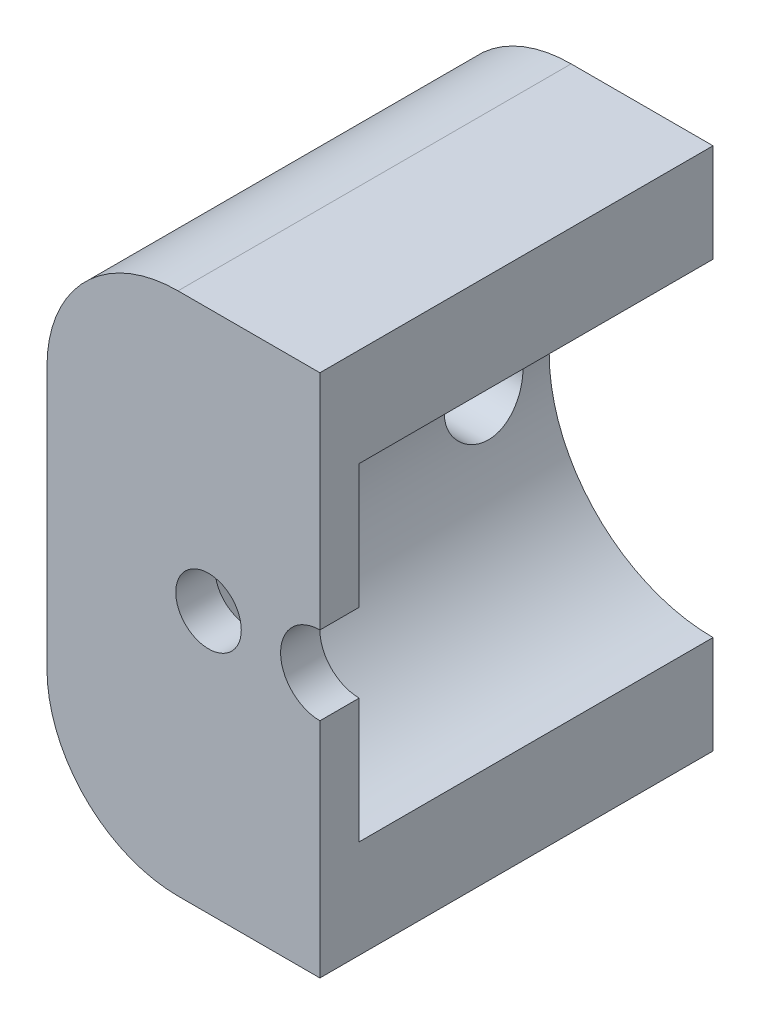
ISO-10303-21;
HEADER;
FILE_DESCRIPTION(('STEP AP214'),'2;1');
FILE_NAME('part.step','',(''),(''),'','','');
FILE_SCHEMA(('AUTOMOTIVE_DESIGN { 1 0 10303 214 1 1 1 1 }'));
ENDSEC;
DATA;
#1=APPLICATION_CONTEXT('core data for automotive mechanical design processes');
#2=APPLICATION_PROTOCOL_DEFINITION('international standard','automotive_design',2000,#1);
#3=PRODUCT_CONTEXT('',#1,'mechanical');
#4=PRODUCT('Part','Part','',(#3));
#5=PRODUCT_RELATED_PRODUCT_CATEGORY('part','',(#4));
#6=PRODUCT_DEFINITION_FORMATION('','',#4);
#7=PRODUCT_DEFINITION_CONTEXT('part definition',#1,'design');
#8=PRODUCT_DEFINITION('design','',#6,#7);
#9=PRODUCT_DEFINITION_SHAPE('','',#8);
#10=(LENGTH_UNIT() NAMED_UNIT(*) SI_UNIT(.MILLI.,.METRE.));
#11=(NAMED_UNIT(*) PLANE_ANGLE_UNIT() SI_UNIT($,.RADIAN.));
#12=(NAMED_UNIT(*) SI_UNIT($,.STERADIAN.) SOLID_ANGLE_UNIT());
#13=UNCERTAINTY_MEASURE_WITH_UNIT(LENGTH_MEASURE(1.E-05),#10,'distance_accuracy_value','');
#14=(GEOMETRIC_REPRESENTATION_CONTEXT(3) GLOBAL_UNCERTAINTY_ASSIGNED_CONTEXT((#13)) GLOBAL_UNIT_ASSIGNED_CONTEXT((#10,
#11,#12)) REPRESENTATION_CONTEXT('',''));
#15=CARTESIAN_POINT('',(0.,0.,0.));
#16=DIRECTION('',(0.,0.,1.));
#17=DIRECTION('',(1.,0.,0.));
#18=AXIS2_PLACEMENT_3D('',#15,#16,#17);
#19=CARTESIAN_POINT('',(-20.8276321226322,0.,5.));
#20=DIRECTION('',(1.,0.,0.));
#21=DIRECTION('',(0.,1.,0.));
#22=AXIS2_PLACEMENT_3D('',#19,#20,#21);
#23=CYLINDRICAL_SURFACE('',#22,2.);
#24=CARTESIAN_POINT('',(-20.8276321226322,0.,5.));
#25=DIRECTION('',(1.,0.,0.));
#26=DIRECTION('',(0.,1.,0.));
#27=AXIS2_PLACEMENT_3D('',#24,#25,#26);
#28=CIRCLE('',#27,2.);
#29=CARTESIAN_POINT('',(-20.8276321226322,1.99999999999999,5.));
#30=VERTEX_POINT('',#29);
#31=EDGE_CURVE('E263',#30,#30,#28,.T.);
#32=ORIENTED_EDGE('',*,*,#31,.F.);
#33=EDGE_LOOP('',(#32));
#34=FACE_BOUND('',#33,.T.);
#35=CARTESIAN_POINT('',(-17.,0.,5.));
#36=DIRECTION('',(1.,0.,0.));
#37=DIRECTION('',(0.,1.,0.));
#38=AXIS2_PLACEMENT_3D('',#35,#36,#37);
#39=CIRCLE('',#38,2.);
#40=CARTESIAN_POINT('',(-17.,1.99999999999999,5.));
#41=VERTEX_POINT('',#40);
#42=EDGE_CURVE('E271',#41,#41,#39,.T.);
#43=ORIENTED_EDGE('',*,*,#42,.T.);
#44=EDGE_LOOP('',(#43));
#45=FACE_BOUND('',#44,.T.);
#46=ADVANCED_FACE('F32',(#34,#45),#23,.F.);
#47=CARTESIAN_POINT('',(-20.8276321226322,0.,20.));
#48=DIRECTION('',(1.,0.,0.));
#49=DIRECTION('',(0.,1.,0.));
#50=AXIS2_PLACEMENT_3D('',#47,#48,#49);
#51=CYLINDRICAL_SURFACE('',#50,2.);
#52=CARTESIAN_POINT('',(-20.8276321226322,0.,20.));
#53=DIRECTION('',(1.,0.,0.));
#54=DIRECTION('',(0.,1.,0.));
#55=AXIS2_PLACEMENT_3D('',#52,#53,#54);
#56=CIRCLE('',#55,2.);
#57=CARTESIAN_POINT('',(-20.8276321226322,1.99999999999999,20.));
#58=VERTEX_POINT('',#57);
#59=EDGE_CURVE('E260',#58,#58,#56,.T.);
#60=ORIENTED_EDGE('',*,*,#59,.F.);
#61=EDGE_LOOP('',(#60));
#62=FACE_BOUND('',#61,.T.);
#63=CARTESIAN_POINT('',(-17.,0.,20.));
#64=DIRECTION('',(1.,0.,0.));
#65=DIRECTION('',(0.,1.,0.));
#66=AXIS2_PLACEMENT_3D('',#63,#64,#65);
#67=CIRCLE('',#66,2.);
#68=CARTESIAN_POINT('',(-17.,2.,20.));
#69=VERTEX_POINT('',#68);
#70=EDGE_CURVE('E272',#69,#69,#67,.T.);
#71=ORIENTED_EDGE('',*,*,#70,.T.);
#72=EDGE_LOOP('',(#71));
#73=FACE_BOUND('',#72,.T.);
#74=ADVANCED_FACE('F176',(#62,#73),#51,.F.);
#75=CARTESIAN_POINT('',(0.,0.,30.));
#76=DIRECTION('',(0.,0.,-1.));
#77=DIRECTION('',(-1.,0.,0.));
#78=AXIS2_PLACEMENT_3D('',#75,#76,#77);
#79=CYLINDRICAL_SURFACE('',#78,12.5);
#80=CARTESIAN_POINT('',(-12.1346610995116,2.99999999999999,5.));
#81=CARTESIAN_POINT('',(-12.1346643709057,2.99999492639599,4.83411368605636));
#82=CARTESIAN_POINT('',(-12.1380998279897,2.98619401575549,4.66816969817757));
#83=CARTESIAN_POINT('',(-12.1514386999622,2.93143372377317,4.34103164728038));
#84=CARTESIAN_POINT('',(-12.1613461803941,2.8904572712724,4.17984063651202));
#85=CARTESIAN_POINT('',(-12.1864438536979,2.78273587845347,3.86698770459709));
#86=CARTESIAN_POINT('',(-12.2016275682829,2.71602252749925,3.71531436580599));
#87=CARTESIAN_POINT('',(-12.2355589227548,2.55881551789465,3.42530045634281));
#88=CARTESIAN_POINT('',(-12.2543066403104,2.46832134098416,3.28696017633045));
#89=CARTESIAN_POINT('',(-12.2936793084446,2.26416092165144,3.02473118505982));
#90=CARTESIAN_POINT('',(-12.3143323081787,2.15010136587795,2.90115284401048));
#91=CARTESIAN_POINT('',(-12.3549444196641,1.9028957631587,2.67468460556583));
#92=CARTESIAN_POINT('',(-12.3749034702238,1.7697480383165,2.57179652880738));
#93=CARTESIAN_POINT('',(-12.4121875957975,1.48603435008244,2.38837356729399));
#94=CARTESIAN_POINT('',(-12.429475709008,1.33526735140697,2.30814147645071));
#95=CARTESIAN_POINT('',(-12.4591511096292,1.02190364344049,2.17427346268216));
#96=CARTESIAN_POINT('',(-12.471539061815,0.859308542342417,2.12063393185467));
#97=CARTESIAN_POINT('',(-12.4898200905274,0.530137152798902,2.04246184561352));
#98=CARTESIAN_POINT('',(-12.4958305032045,0.363692527540991,2.01740278579179));
#99=CARTESIAN_POINT('',(-12.5010873481438,0.0288605739758508,1.99545248030836));
#100=CARTESIAN_POINT('',(-12.5003347050497,-0.139526485618317,1.99855738407585));
#101=CARTESIAN_POINT('',(-12.4922383642801,-0.469819197188804,2.03246370078499));
#102=CARTESIAN_POINT('',(-12.4850298487431,-0.631786969117113,2.06269708416856));
#103=CARTESIAN_POINT('',(-12.4649879597451,-0.94827991582928,2.14909173796286));
#104=CARTESIAN_POINT('',(-12.4521543006312,-1.10280471220599,2.20525432510285));
#105=CARTESIAN_POINT('',(-12.4220937673228,-1.40154850796016,2.34238683274778));
#106=CARTESIAN_POINT('',(-12.4048305309055,-1.54566890739798,2.42356325576841));
#107=CARTESIAN_POINT('',(-12.3677903650575,-1.8184437481507,2.60826343366629));
#108=CARTESIAN_POINT('',(-12.3480130295253,-1.94709568430374,2.71179080077329));
#109=CARTESIAN_POINT('',(-12.307523454591,-2.18866676072893,2.9413154010846));
#110=CARTESIAN_POINT('',(-12.2868002024656,-2.30111257110785,3.06780936616896));
#111=CARTESIAN_POINT('',(-12.247210122564,-2.5032955488926,3.33807563615842));
#112=CARTESIAN_POINT('',(-12.2283433682075,-2.59303181841777,3.48184862390317));
#113=CARTESIAN_POINT('',(-12.1945661246798,-2.7475198631376,3.78346525626311));
#114=CARTESIAN_POINT('',(-12.1796724534131,-2.812165941329,3.94136505107637));
#115=CARTESIAN_POINT('',(-12.155748323081,-2.91385324316721,4.26623312347684));
#116=CARTESIAN_POINT('',(-12.1467167199581,-2.95089985341172,4.43319962468334));
#117=CARTESIAN_POINT('',(-12.1357772660229,-2.99556850234643,4.76709338006787));
#118=CARTESIAN_POINT('',(-12.1337008786289,-3.00388683328911,4.93392207251082));
#119=CARTESIAN_POINT('',(-12.1364495609797,-2.99276203410493,5.2665831940748));
#120=CARTESIAN_POINT('',(-12.1412740503119,-2.97332123871796,5.43241570580372));
#121=CARTESIAN_POINT('',(-12.1571201522343,-2.90783852027802,5.75584591726093));
#122=CARTESIAN_POINT('',(-12.1680489760353,-2.86219461484814,5.91352917591693));
#123=CARTESIAN_POINT('',(-12.1947857126682,-2.74603914988784,6.21900782066707));
#124=CARTESIAN_POINT('',(-12.2105941678427,-2.67552482603031,6.3668021054363));
#125=CARTESIAN_POINT('',(-12.2456689266469,-2.51014743676235,6.65127875220396));
#126=CARTESIAN_POINT('',(-12.2649930224287,-2.41486385815303,6.78770937400605));
#127=CARTESIAN_POINT('',(-12.3047764880024,-2.20319051610381,7.04290073389391));
#128=CARTESIAN_POINT('',(-12.3252360287629,-2.08679756812263,7.16165880098545));
#129=CARTESIAN_POINT('',(-12.3655511140332,-1.83302860512641,7.38091500960925));
#130=CARTESIAN_POINT('',(-12.3853821651221,-1.69523379949056,7.48093375598967));
#131=CARTESIAN_POINT('',(-12.4217193399952,-1.40439761806721,7.65640846308504));
#132=CARTESIAN_POINT('',(-12.438225632785,-1.25135701785303,7.73186567244466));
#133=CARTESIAN_POINT('',(-12.4659520953338,-0.935406182533397,7.85544747727503));
#134=CARTESIAN_POINT('',(-12.4772089625634,-0.772573732033524,7.90376232052163));
#135=CARTESIAN_POINT('',(-12.4933282808784,-0.440797516621211,7.97226782039686));
#136=CARTESIAN_POINT('',(-12.4981918632553,-0.271854838350959,7.99246345275549));
#137=CARTESIAN_POINT('',(-12.5009346170348,0.0628273325379051,8.00389586778703));
#138=CARTESIAN_POINT('',(-12.4989850590467,0.228541548592047,7.9958427559416));
#139=CARTESIAN_POINT('',(-12.4886960978661,0.55618158810627,7.95262003698245));
#140=CARTESIAN_POINT('',(-12.4803568581455,0.718107508375782,7.91745112359129));
#141=CARTESIAN_POINT('',(-12.4582475403262,1.03289533638029,7.82136317488429));
#142=CARTESIAN_POINT('',(-12.4445026408745,1.18579554017998,7.76056343055918));
#143=CARTESIAN_POINT('',(-12.4130357959962,1.47930912419136,7.6150497558514));
#144=CARTESIAN_POINT('',(-12.3953133850962,1.6199210636753,7.53033302625372));
#145=CARTESIAN_POINT('',(-12.3573152907204,1.8882670115378,7.33717452572309));
#146=CARTESIAN_POINT('',(-12.3369914041701,2.01564306622629,7.22824492925642));
#147=CARTESIAN_POINT('',(-12.2963112747441,2.25054951565268,6.99071238941027));
#148=CARTESIAN_POINT('',(-12.2759550250775,2.35807496614236,6.86210455926369));
#149=CARTESIAN_POINT('',(-12.2371275634283,2.55199485185679,6.58626060583986));
#150=CARTESIAN_POINT('',(-12.2186938455572,2.63800316633773,6.438747379493));
#151=CARTESIAN_POINT('',(-12.1862909651906,2.78387070894251,6.13093815349446));
#152=CARTESIAN_POINT('',(-12.1723183758181,2.84375002144868,5.97065208432893));
#153=CARTESIAN_POINT('',(-12.1527391085338,2.92614436386636,5.67540714648592));
#154=CARTESIAN_POINT('',(-12.1460087939348,2.95378236710749,5.5419291717888));
#155=CARTESIAN_POINT('',(-12.1369686046644,2.99071161192545,5.27231362592919));
#156=CARTESIAN_POINT('',(-12.1346584140208,3.00000416492674,5.13617624557697));
#157=CARTESIAN_POINT('',(-12.1346610995116,2.99999999999999,5.));
#158=B_SPLINE_CURVE_WITH_KNOTS('',3,(#80,#81,#82,#83,#84,#85,#86,#87,#88,#89,#90,#91,#92,#93,
#94,#95,#96,#97,#98,#99,#100,#101,#102,#103,#104,#105,#106,#107,#108,#109,#110,#111,#112,#113,
#114,#115,#116,#117,#118,#119,#120,#121,#122,#123,#124,#125,#126,#127,#128,#129,#130,#131,#132,
#133,#134,#135,#136,#137,#138,#139,#140,#141,#142,#143,#144,#145,#146,#147,#148,#149,#150,#151,
#152,#153,#154,#155,#156,#157),.UNSPECIFIED.,.T.,.F.,(4,2,2,2,2,2,2,2,2,2,2,2,2,2,2,2,2,2,2,2,2,
2,2,2,2,2,2,2,2,2,2,2,2,2,2,2,2,2,4),(0.,0.497159212189433,0.994631026538901,1.49149417875255,
1.98836816009861,2.49432418194046,3.00032470584734,3.51279830766303,4.02520236141814,
4.52800628486068,5.03074146609936,5.52318961529223,6.01566277459448,6.51231571921414,
7.00904899016388,7.51819168467208,8.02735450631452,8.5386395722652,9.04982482437227,
9.54852995993759,10.047193153326,10.5384749824062,11.0298114342859,11.5301065260645,
12.0304771548043,12.5422844123508,13.0540656468818,13.5622134292334,14.0702712827588,
14.5656502933719,15.0610166307768,15.5541024543049,16.047246011943,16.5514085771014,
17.0556965465884,17.56847227941,18.0808531634825,18.4890008491296,18.8971193572843),.UNSPECIFIED.);
#159=CARTESIAN_POINT('',(-12.1346610995116,2.99999999999999,5.));
#160=VERTEX_POINT('',#159);
#161=EDGE_CURVE('E159',#160,#160,#158,.T.);
#162=ORIENTED_EDGE('',*,*,#161,.T.);
#163=EDGE_LOOP('',(#162));
#164=FACE_BOUND('',#163,.T.);
#165=CARTESIAN_POINT('',(-12.1346610995116,3.,20.));
#166=CARTESIAN_POINT('',(-12.1346643709057,2.99999492639599,19.8341136860564));
#167=CARTESIAN_POINT('',(-12.1380998279897,2.98619401575549,19.6681696981776));
#168=CARTESIAN_POINT('',(-12.1514386999622,2.93143372377317,19.3410316472804));
#169=CARTESIAN_POINT('',(-12.1613461803941,2.8904572712724,19.179840636512));
#170=CARTESIAN_POINT('',(-12.1864438536979,2.78273587845348,18.8669877045971));
#171=CARTESIAN_POINT('',(-12.2016275682829,2.71602252749926,18.715314365806));
#172=CARTESIAN_POINT('',(-12.2355589227548,2.55881551789466,18.4253004563428));
#173=CARTESIAN_POINT('',(-12.2543066403104,2.46832134098416,18.2869601763305));
#174=CARTESIAN_POINT('',(-12.2936793084446,2.26416092165144,18.0247311850598));
#175=CARTESIAN_POINT('',(-12.3143323081787,2.15010136587795,17.9011528440105));
#176=CARTESIAN_POINT('',(-12.3549444196641,1.9028957631587,17.6746846055658));
#177=CARTESIAN_POINT('',(-12.3749034702238,1.7697480383165,17.5717965288074));
#178=CARTESIAN_POINT('',(-12.4121875957975,1.48603435008244,17.388373567294));
#179=CARTESIAN_POINT('',(-12.429475709008,1.33526735140697,17.3081414764507));
#180=CARTESIAN_POINT('',(-12.4591511096292,1.02190364344049,17.1742734626822));
#181=CARTESIAN_POINT('',(-12.471539061815,0.859308542342421,17.1206339318547));
#182=CARTESIAN_POINT('',(-12.4898200905274,0.530137152798906,17.0424618456135));
#183=CARTESIAN_POINT('',(-12.4958305032045,0.363692527540995,17.0174027857918));
#184=CARTESIAN_POINT('',(-12.5010873481438,0.0288605739758556,16.9954524803084));
#185=CARTESIAN_POINT('',(-12.5003347050497,-0.139526485618312,16.9985573840759));
#186=CARTESIAN_POINT('',(-12.4922383642801,-0.469819197188799,17.032463700785));
#187=CARTESIAN_POINT('',(-12.4850298487431,-0.631786969117108,17.0626970841686));
#188=CARTESIAN_POINT('',(-12.4649879597451,-0.948279915829275,17.1490917379629));
#189=CARTESIAN_POINT('',(-12.4521543006312,-1.10280471220598,17.2052543251028));
#190=CARTESIAN_POINT('',(-12.4220937673228,-1.40154850796015,17.3423868327478));
#191=CARTESIAN_POINT('',(-12.4048305309055,-1.54566890739798,17.4235632557684));
#192=CARTESIAN_POINT('',(-12.3677903650575,-1.8184437481507,17.6082634336663));
#193=CARTESIAN_POINT('',(-12.3480130295253,-1.94709568430374,17.7117908007733));
#194=CARTESIAN_POINT('',(-12.307523454591,-2.18866676072893,17.9413154010846));
#195=CARTESIAN_POINT('',(-12.2868002024656,-2.30111257110785,18.067809366169));
#196=CARTESIAN_POINT('',(-12.247210122564,-2.50329554889259,18.3380756361584));
#197=CARTESIAN_POINT('',(-12.2283433682075,-2.59303181841777,18.4818486239032));
#198=CARTESIAN_POINT('',(-12.1945661246798,-2.74751986313759,18.7834652562631));
#199=CARTESIAN_POINT('',(-12.1796724534131,-2.81216594132899,18.9413650510764));
#200=CARTESIAN_POINT('',(-12.155748323081,-2.91385324316721,19.2662331234768));
#201=CARTESIAN_POINT('',(-12.1467167199581,-2.95089985341172,19.4331996246833));
#202=CARTESIAN_POINT('',(-12.1357772660229,-2.99556850234643,19.7670933800679));
#203=CARTESIAN_POINT('',(-12.1337008786289,-3.00388683328911,19.9339220725108));
#204=CARTESIAN_POINT('',(-12.1364495609797,-2.99276203410494,20.2665831940748));
#205=CARTESIAN_POINT('',(-12.1412740503119,-2.97332123871796,20.4324157058037));
#206=CARTESIAN_POINT('',(-12.1571201522343,-2.90783852027802,20.7558459172609));
#207=CARTESIAN_POINT('',(-12.1680489760353,-2.86219461484815,20.9135291759169));
#208=CARTESIAN_POINT('',(-12.1947857126682,-2.74603914988785,21.2190078206671));
#209=CARTESIAN_POINT('',(-12.2105941678427,-2.67552482603031,21.3668021054363));
#210=CARTESIAN_POINT('',(-12.2456689266469,-2.51014743676235,21.651278752204));
#211=CARTESIAN_POINT('',(-12.2649930224287,-2.41486385815304,21.787709374006));
#212=CARTESIAN_POINT('',(-12.3047764880024,-2.20319051610381,22.0429007338939));
#213=CARTESIAN_POINT('',(-12.3252360287629,-2.08679756812264,22.1616588009855));
#214=CARTESIAN_POINT('',(-12.3655511140332,-1.83302860512641,22.3809150096093));
#215=CARTESIAN_POINT('',(-12.3853821651221,-1.69523379949057,22.4809337559897));
#216=CARTESIAN_POINT('',(-12.4217193399952,-1.40439761806722,22.656408463085));
#217=CARTESIAN_POINT('',(-12.438225632785,-1.25135701785303,22.7318656724447));
#218=CARTESIAN_POINT('',(-12.4659520953338,-0.935406182533403,22.855447477275));
#219=CARTESIAN_POINT('',(-12.4772089625634,-0.772573732033531,22.9037623205216));
#220=CARTESIAN_POINT('',(-12.4933282808784,-0.440797516621218,22.9722678203969));
#221=CARTESIAN_POINT('',(-12.4981918632553,-0.271854838350965,22.9924634527555));
#222=CARTESIAN_POINT('',(-12.5009346170348,0.0628273325378987,23.003895867787));
#223=CARTESIAN_POINT('',(-12.4989850590467,0.228541548592041,22.9958427559416));
#224=CARTESIAN_POINT('',(-12.4886960978661,0.556181588106263,22.9526200369825));
#225=CARTESIAN_POINT('',(-12.4803568581455,0.718107508375776,22.9174511235913));
#226=CARTESIAN_POINT('',(-12.4582475403262,1.03289533638028,22.8213631748843));
#227=CARTESIAN_POINT('',(-12.4445026408745,1.18579554017998,22.7605634305592));
#228=CARTESIAN_POINT('',(-12.4130357959962,1.47930912419135,22.6150497558514));
#229=CARTESIAN_POINT('',(-12.3953133850962,1.6199210636753,22.5303330262537));
#230=CARTESIAN_POINT('',(-12.3573152907204,1.8882670115378,22.3371745257231));
#231=CARTESIAN_POINT('',(-12.3369914041701,2.01564306622628,22.2282449292564));
#232=CARTESIAN_POINT('',(-12.2963112747441,2.25054951565268,21.9907123894103));
#233=CARTESIAN_POINT('',(-12.2759550250775,2.35807496614236,21.8621045592637));
#234=CARTESIAN_POINT('',(-12.2371275634283,2.55199485185679,21.5862606058399));
#235=CARTESIAN_POINT('',(-12.2186938455572,2.63800316633773,21.438747379493));
#236=CARTESIAN_POINT('',(-12.1862909651906,2.78387070894251,21.1309381534945));
#237=CARTESIAN_POINT('',(-12.1723183758181,2.84375002144868,20.9706520843289));
#238=CARTESIAN_POINT('',(-12.1527391085338,2.92614436386636,20.6754071464859));
#239=CARTESIAN_POINT('',(-12.1460087939348,2.95378236710749,20.5419291717888));
#240=CARTESIAN_POINT('',(-12.1369686046644,2.99071161192545,20.2723136259292));
#241=CARTESIAN_POINT('',(-12.1346584140208,3.00000416492674,20.136176245577));
#242=CARTESIAN_POINT('',(-12.1346610995116,3.,20.));
#243=B_SPLINE_CURVE_WITH_KNOTS('',3,(#165,#166,#167,#168,#169,#170,#171,#172,#173,#174,#175,
#176,#177,#178,#179,#180,#181,#182,#183,#184,#185,#186,#187,#188,#189,#190,#191,#192,#193,#194,
#195,#196,#197,#198,#199,#200,#201,#202,#203,#204,#205,#206,#207,#208,#209,#210,#211,#212,#213,
#214,#215,#216,#217,#218,#219,#220,#221,#222,#223,#224,#225,#226,#227,#228,#229,#230,#231,#232,
#233,#234,#235,#236,#237,#238,#239,#240,#241,#242),.UNSPECIFIED.,.T.,.F.,(4,2,2,2,2,2,2,2,2,2,2,
2,2,2,2,2,2,2,2,2,2,2,2,2,2,2,2,2,2,2,2,2,2,2,2,2,2,2,4),(0.,0.49715921218943,0.994631026538898,
1.49149417875254,1.98836816009861,2.49432418194045,3.00032470584734,3.51279830766303,
4.02520236141813,4.52800628486068,5.03074146609936,5.52318961529222,6.01566277459447,
6.51231571921414,7.00904899016388,7.51819168467208,8.02735450631452,8.5386395722652,
9.04982482437227,9.54852995993759,10.047193153326,10.5384749824062,11.0298114342859,
11.5301065260645,12.0304771548043,12.5422844123508,13.0540656468818,13.5622134292334,
14.0702712827588,14.5656502933719,15.0610166307768,15.5541024543049,16.047246011943,
16.5514085771014,17.0556965465884,17.56847227941,18.0808531634825,18.4890008491296,
18.8971193572843),.UNSPECIFIED.);
#244=CARTESIAN_POINT('',(-12.1346610995116,3.,20.));
#245=VERTEX_POINT('',#244);
#246=EDGE_CURVE('E151',#245,#245,#243,.T.);
#247=ORIENTED_EDGE('',*,*,#246,.T.);
#248=EDGE_LOOP('',(#247));
#249=FACE_BOUND('',#248,.T.);
#250=CARTESIAN_POINT('',(0.,0.,27.));
#251=DIRECTION('',(0.,0.,1.));
#252=DIRECTION('',(1.,0.,0.));
#253=AXIS2_PLACEMENT_3D('',#250,#251,#252);
#254=CIRCLE('',#253,12.5);
#255=CARTESIAN_POINT('',(0.,12.5,27.));
#256=VERTEX_POINT('',#255);
#257=CARTESIAN_POINT('',(0.,-12.5,27.));
#258=VERTEX_POINT('',#257);
#259=EDGE_CURVE('E115',#256,#258,#254,.T.);
#260=ORIENTED_EDGE('',*,*,#259,.T.);
#261=DIRECTION('',(0.,0.,-1.));
#262=VECTOR('',#261,1.);
#263=CARTESIAN_POINT('',(0.,-12.5,30.));
#264=LINE('',#263,#262);
#265=CARTESIAN_POINT('',(0.,-12.5,0.));
#266=VERTEX_POINT('',#265);
#267=EDGE_CURVE('E127',#258,#266,#264,.T.);
#268=ORIENTED_EDGE('',*,*,#267,.T.);
#269=CARTESIAN_POINT('',(0.,0.,0.));
#270=DIRECTION('',(0.,0.,-1.));
#271=DIRECTION('',(1.,0.,0.));
#272=AXIS2_PLACEMENT_3D('',#269,#270,#271);
#273=CIRCLE('',#272,12.5);
#274=CARTESIAN_POINT('',(0.,12.5,0.));
#275=VERTEX_POINT('',#274);
#276=EDGE_CURVE('E225',#266,#275,#273,.T.);
#277=ORIENTED_EDGE('',*,*,#276,.T.);
#278=DIRECTION('',(0.,0.,-1.));
#279=VECTOR('',#278,1.);
#280=CARTESIAN_POINT('',(0.,12.5,30.));
#281=LINE('',#280,#279);
#282=EDGE_CURVE('E129',#256,#275,#281,.T.);
#283=ORIENTED_EDGE('',*,*,#282,.F.);
#284=EDGE_LOOP('',(#260,#268,#277,#283));
#285=FACE_BOUND('',#284,.T.);
#286=ADVANCED_FACE('F125',(#164,#249,#285),#79,.F.);
#287=CARTESIAN_POINT('',(0.,20.,30.));
#288=DIRECTION('',(-1.,0.,0.));
#289=DIRECTION('',(0.,-1.,0.));
#290=AXIS2_PLACEMENT_3D('',#287,#288,#289);
#291=PLANE('',#290);
#292=DIRECTION('',(0.,1.,0.));
#293=VECTOR('',#292,1.);
#294=CARTESIAN_POINT('',(0.,20.,0.));
#295=LINE('',#294,#293);
#296=CARTESIAN_POINT('',(0.,20.,0.));
#297=VERTEX_POINT('',#296);
#298=EDGE_CURVE('E222',#275,#297,#295,.T.);
#299=ORIENTED_EDGE('',*,*,#298,.T.);
#300=DIRECTION('',(0.,0.,-1.));
#301=VECTOR('',#300,1.);
#302=CARTESIAN_POINT('',(0.,20.,30.));
#303=LINE('',#302,#301);
#304=CARTESIAN_POINT('',(0.,20.,30.));
#305=VERTEX_POINT('',#304);
#306=EDGE_CURVE('E140',#305,#297,#303,.T.);
#307=ORIENTED_EDGE('',*,*,#306,.F.);
#308=DIRECTION('',(0.,1.,0.));
#309=VECTOR('',#308,1.);
#310=CARTESIAN_POINT('',(0.,20.,30.));
#311=LINE('',#310,#309);
#312=CARTESIAN_POINT('',(0.,3.,30.));
#313=VERTEX_POINT('',#312);
#314=EDGE_CURVE('E238',#313,#305,#311,.T.);
#315=ORIENTED_EDGE('',*,*,#314,.F.);
#316=DIRECTION('',(0.,0.,1.));
#317=VECTOR('',#316,1.);
#318=CARTESIAN_POINT('',(0.,3.,27.));
#319=LINE('',#318,#317);
#320=CARTESIAN_POINT('',(0.,3.,27.));
#321=VERTEX_POINT('',#320);
#322=EDGE_CURVE('E248',#321,#313,#319,.T.);
#323=ORIENTED_EDGE('',*,*,#322,.F.);
#324=DIRECTION('',(0.,1.,0.));
#325=VECTOR('',#324,1.);
#326=CARTESIAN_POINT('',(0.,12.5,27.));
#327=LINE('',#326,#325);
#328=EDGE_CURVE('E251',#321,#256,#327,.T.);
#329=ORIENTED_EDGE('',*,*,#328,.T.);
#330=ORIENTED_EDGE('',*,*,#282,.T.);
#331=EDGE_LOOP('',(#299,#307,#315,#323,#329,#330));
#332=FACE_BOUND('',#331,.T.);
#333=ADVANCED_FACE('F213',(#332),#291,.F.);
#334=CARTESIAN_POINT('',(-20.8276321226322,20.,30.));
#335=DIRECTION('',(0.,-1.,0.));
#336=DIRECTION('',(0.,0.,-1.));
#337=AXIS2_PLACEMENT_3D('',#334,#335,#336);
#338=PLANE('',#337);
#339=DIRECTION('',(-1.,0.,0.));
#340=VECTOR('',#339,1.);
#341=CARTESIAN_POINT('',(-20.8276321226322,20.,0.));
#342=LINE('',#341,#340);
#343=CARTESIAN_POINT('',(-10.8276321226322,20.,0.));
#344=VERTEX_POINT('',#343);
#345=EDGE_CURVE('E224',#297,#344,#342,.T.);
#346=ORIENTED_EDGE('',*,*,#345,.T.);
#347=DIRECTION('',(0.,0.,-1.));
#348=VECTOR('',#347,1.);
#349=CARTESIAN_POINT('',(-10.8276321226322,20.,30.));
#350=LINE('',#349,#348);
#351=CARTESIAN_POINT('',(-10.8276321226322,20.,30.));
#352=VERTEX_POINT('',#351);
#353=EDGE_CURVE('E11',#344,#352,#350,.F.);
#354=ORIENTED_EDGE('',*,*,#353,.T.);
#355=DIRECTION('',(-1.,0.,0.));
#356=VECTOR('',#355,1.);
#357=CARTESIAN_POINT('',(-20.8276321226322,20.,30.));
#358=LINE('',#357,#356);
#359=EDGE_CURVE('E227',#305,#352,#358,.T.);
#360=ORIENTED_EDGE('',*,*,#359,.F.);
#361=ORIENTED_EDGE('',*,*,#306,.T.);
#362=EDGE_LOOP('',(#346,#354,#360,#361));
#363=FACE_BOUND('',#362,.T.);
#364=ADVANCED_FACE('F210',(#363),#338,.F.);
#365=CARTESIAN_POINT('',(-20.8276321226322,20.,30.));
#366=DIRECTION('',(1.,0.,0.));
#367=DIRECTION('',(0.,0.,-1.));
#368=AXIS2_PLACEMENT_3D('',#365,#366,#367);
#369=PLANE('',#368);
#370=ORIENTED_EDGE('',*,*,#59,.T.);
#371=EDGE_LOOP('',(#370));
#372=FACE_BOUND('',#371,.T.);
#373=ORIENTED_EDGE('',*,*,#31,.T.);
#374=EDGE_LOOP('',(#373));
#375=FACE_BOUND('',#374,.T.);
#376=DIRECTION('',(0.,-1.,0.));
#377=VECTOR('',#376,1.);
#378=CARTESIAN_POINT('',(-20.8276321226322,20.,0.));
#379=LINE('',#378,#377);
#380=CARTESIAN_POINT('',(-20.8276321226322,10.,0.));
#381=VERTEX_POINT('',#380);
#382=CARTESIAN_POINT('',(-20.8276321226322,-10.,0.));
#383=VERTEX_POINT('',#382);
#384=EDGE_CURVE('E231',#381,#383,#379,.T.);
#385=ORIENTED_EDGE('',*,*,#384,.T.);
#386=DIRECTION('',(0.,0.,-1.));
#387=VECTOR('',#386,1.);
#388=CARTESIAN_POINT('',(-20.8276321226322,-10.,30.));
#389=LINE('',#388,#387);
#390=CARTESIAN_POINT('',(-20.8276321226322,-10.,30.));
#391=VERTEX_POINT('',#390);
#392=EDGE_CURVE('E53',#383,#391,#389,.F.);
#393=ORIENTED_EDGE('',*,*,#392,.T.);
#394=DIRECTION('',(0.,-1.,0.));
#395=VECTOR('',#394,1.);
#396=CARTESIAN_POINT('',(-20.8276321226322,20.,30.));
#397=LINE('',#396,#395);
#398=CARTESIAN_POINT('',(-20.8276321226322,10.,30.));
#399=VERTEX_POINT('',#398);
#400=EDGE_CURVE('E241',#399,#391,#397,.T.);
#401=ORIENTED_EDGE('',*,*,#400,.F.);
#402=DIRECTION('',(0.,0.,-1.));
#403=VECTOR('',#402,1.);
#404=CARTESIAN_POINT('',(-20.8276321226322,10.,30.));
#405=LINE('',#404,#403);
#406=EDGE_CURVE('E432',#399,#381,#405,.T.);
#407=ORIENTED_EDGE('',*,*,#406,.T.);
#408=EDGE_LOOP('',(#385,#393,#401,#407));
#409=FACE_BOUND('',#408,.T.);
#410=ADVANCED_FACE('F206',(#372,#375,#409),#369,.F.);
#411=CARTESIAN_POINT('',(-20.8276321226322,-20.,30.));
#412=DIRECTION('',(0.,1.,0.));
#413=DIRECTION('',(0.,0.,1.));
#414=AXIS2_PLACEMENT_3D('',#411,#412,#413);
#415=PLANE('',#414);
#416=DIRECTION('',(1.,0.,0.));
#417=VECTOR('',#416,1.);
#418=CARTESIAN_POINT('',(-20.8276321226322,-20.,30.));
#419=LINE('',#418,#417);
#420=CARTESIAN_POINT('',(-10.8276321226322,-20.,30.));
#421=VERTEX_POINT('',#420);
#422=CARTESIAN_POINT('',(0.,-20.,30.));
#423=VERTEX_POINT('',#422);
#424=EDGE_CURVE('E142',#421,#423,#419,.T.);
#425=ORIENTED_EDGE('',*,*,#424,.F.);
#426=DIRECTION('',(0.,0.,-1.));
#427=VECTOR('',#426,1.);
#428=CARTESIAN_POINT('',(-10.8276321226322,-20.,30.));
#429=LINE('',#428,#427);
#430=CARTESIAN_POINT('',(-10.8276321226322,-20.,0.));
#431=VERTEX_POINT('',#430);
#432=EDGE_CURVE('E150',#421,#431,#429,.T.);
#433=ORIENTED_EDGE('',*,*,#432,.T.);
#434=DIRECTION('',(1.,0.,0.));
#435=VECTOR('',#434,1.);
#436=CARTESIAN_POINT('',(-20.8276321226322,-20.,0.));
#437=LINE('',#436,#435);
#438=CARTESIAN_POINT('',(0.,-20.,0.));
#439=VERTEX_POINT('',#438);
#440=EDGE_CURVE('E233',#431,#439,#437,.T.);
#441=ORIENTED_EDGE('',*,*,#440,.T.);
#442=DIRECTION('',(0.,0.,-1.));
#443=VECTOR('',#442,1.);
#444=CARTESIAN_POINT('',(0.,-20.,30.));
#445=LINE('',#444,#443);
#446=EDGE_CURVE('E137',#423,#439,#445,.T.);
#447=ORIENTED_EDGE('',*,*,#446,.F.);
#448=EDGE_LOOP('',(#425,#433,#441,#447));
#449=FACE_BOUND('',#448,.T.);
#450=ADVANCED_FACE('F203',(#449),#415,.F.);
#451=CARTESIAN_POINT('',(0.,-20.,30.));
#452=DIRECTION('',(-1.,0.,0.));
#453=DIRECTION('',(0.,-1.,0.));
#454=AXIS2_PLACEMENT_3D('',#451,#452,#453);
#455=PLANE('',#454);
#456=DIRECTION('',(0.,1.,0.));
#457=VECTOR('',#456,1.);
#458=CARTESIAN_POINT('',(0.,-20.,0.));
#459=LINE('',#458,#457);
#460=EDGE_CURVE('E135',#439,#266,#459,.T.);
#461=ORIENTED_EDGE('',*,*,#460,.T.);
#462=ORIENTED_EDGE('',*,*,#267,.F.);
#463=DIRECTION('',(0.,1.,0.));
#464=VECTOR('',#463,1.);
#465=CARTESIAN_POINT('',(0.,-3.,27.));
#466=LINE('',#465,#464);
#467=CARTESIAN_POINT('',(0.,-3.,27.));
#468=VERTEX_POINT('',#467);
#469=EDGE_CURVE('E111',#258,#468,#466,.T.);
#470=ORIENTED_EDGE('',*,*,#469,.T.);
#471=DIRECTION('',(0.,0.,1.));
#472=VECTOR('',#471,1.);
#473=CARTESIAN_POINT('',(0.,-3.,27.));
#474=LINE('',#473,#472);
#475=CARTESIAN_POINT('',(0.,-3.,30.));
#476=VERTEX_POINT('',#475);
#477=EDGE_CURVE('E244',#468,#476,#474,.T.);
#478=ORIENTED_EDGE('',*,*,#477,.T.);
#479=DIRECTION('',(0.,1.,0.));
#480=VECTOR('',#479,1.);
#481=CARTESIAN_POINT('',(0.,-20.,30.));
#482=LINE('',#481,#480);
#483=EDGE_CURVE('E138',#423,#476,#482,.T.);
#484=ORIENTED_EDGE('',*,*,#483,.F.);
#485=ORIENTED_EDGE('',*,*,#446,.T.);
#486=EDGE_LOOP('',(#461,#462,#470,#478,#484,#485));
#487=FACE_BOUND('',#486,.T.);
#488=ADVANCED_FACE('F132',(#487),#455,.F.);
#489=CARTESIAN_POINT('',(0.,0.,30.));
#490=DIRECTION('',(0.,0.,1.));
#491=DIRECTION('',(1.,0.,0.));
#492=AXIS2_PLACEMENT_3D('',#489,#490,#491);
#493=PLANE('',#492);
#494=ORIENTED_EDGE('',*,*,#400,.T.);
#495=CARTESIAN_POINT('',(-10.8276321226322,-10.,30.));
#496=DIRECTION('',(0.,0.,1.));
#497=DIRECTION('',(1.,0.,0.));
#498=AXIS2_PLACEMENT_3D('',#495,#496,#497);
#499=CIRCLE('',#498,10.);
#500=EDGE_CURVE('E40',#391,#421,#499,.T.);
#501=ORIENTED_EDGE('',*,*,#500,.T.);
#502=ORIENTED_EDGE('',*,*,#424,.T.);
#503=ORIENTED_EDGE('',*,*,#483,.T.);
#504=CARTESIAN_POINT('',(0.,0.,30.));
#505=DIRECTION('',(0.,0.,-1.));
#506=DIRECTION('',(1.,0.,0.));
#507=AXIS2_PLACEMENT_3D('',#504,#505,#506);
#508=CIRCLE('',#507,3.);
#509=EDGE_CURVE('E130',#476,#313,#508,.T.);
#510=ORIENTED_EDGE('',*,*,#509,.T.);
#511=ORIENTED_EDGE('',*,*,#314,.T.);
#512=ORIENTED_EDGE('',*,*,#359,.T.);
#513=CARTESIAN_POINT('',(-10.8276321226322,10.,30.));
#514=DIRECTION('',(0.,0.,1.));
#515=DIRECTION('',(1.,0.,0.));
#516=AXIS2_PLACEMENT_3D('',#513,#514,#515);
#517=CIRCLE('',#516,10.);
#518=EDGE_CURVE('E430',#352,#399,#517,.T.);
#519=ORIENTED_EDGE('',*,*,#518,.T.);
#520=EDGE_LOOP('',(#494,#501,#502,#503,#510,#511,#512,#519));
#521=FACE_BOUND('',#520,.T.);
#522=CARTESIAN_POINT('',(-8.50000000000005,0.,30.));
#523=DIRECTION('',(0.,0.,1.));
#524=DIRECTION('',(1.,0.,0.));
#525=AXIS2_PLACEMENT_3D('',#522,#523,#524);
#526=CIRCLE('',#525,2.5);
#527=CARTESIAN_POINT('',(-6.00000000000005,0.,30.));
#528=VERTEX_POINT('',#527);
#529=EDGE_CURVE('E257',#528,#528,#526,.T.);
#530=ORIENTED_EDGE('',*,*,#529,.F.);
#531=EDGE_LOOP('',(#530));
#532=FACE_BOUND('',#531,.T.);
#533=ADVANCED_FACE('F194',(#521,#532),#493,.T.);
#534=CARTESIAN_POINT('',(0.,0.,0.));
#535=DIRECTION('',(0.,0.,1.));
#536=DIRECTION('',(1.,0.,0.));
#537=AXIS2_PLACEMENT_3D('',#534,#535,#536);
#538=PLANE('',#537);
#539=ORIENTED_EDGE('',*,*,#440,.F.);
#540=CARTESIAN_POINT('',(-10.8276321226322,-10.,0.));
#541=DIRECTION('',(0.,0.,1.));
#542=DIRECTION('',(1.,0.,0.));
#543=AXIS2_PLACEMENT_3D('',#540,#541,#542);
#544=CIRCLE('',#543,10.);
#545=EDGE_CURVE('E437',#431,#383,#544,.F.);
#546=ORIENTED_EDGE('',*,*,#545,.T.);
#547=ORIENTED_EDGE('',*,*,#384,.F.);
#548=CARTESIAN_POINT('',(-10.8276321226322,10.,0.));
#549=DIRECTION('',(0.,0.,1.));
#550=DIRECTION('',(1.,0.,0.));
#551=AXIS2_PLACEMENT_3D('',#548,#549,#550);
#552=CIRCLE('',#551,10.);
#553=EDGE_CURVE('E230',#381,#344,#552,.F.);
#554=ORIENTED_EDGE('',*,*,#553,.T.);
#555=ORIENTED_EDGE('',*,*,#345,.F.);
#556=ORIENTED_EDGE('',*,*,#298,.F.);
#557=ORIENTED_EDGE('',*,*,#276,.F.);
#558=ORIENTED_EDGE('',*,*,#460,.F.);
#559=EDGE_LOOP('',(#539,#546,#547,#554,#555,#556,#557,#558));
#560=FACE_BOUND('',#559,.T.);
#561=ADVANCED_FACE('F192',(#560),#538,.F.);
#562=CARTESIAN_POINT('',(0.,0.,27.));
#563=DIRECTION('',(0.,0.,1.));
#564=DIRECTION('',(1.,0.,0.));
#565=AXIS2_PLACEMENT_3D('',#562,#563,#564);
#566=CYLINDRICAL_SURFACE('',#565,3.);
#567=ORIENTED_EDGE('',*,*,#509,.F.);
#568=ORIENTED_EDGE('',*,*,#477,.F.);
#569=CARTESIAN_POINT('',(0.,0.,27.));
#570=DIRECTION('',(0.,0.,-1.));
#571=DIRECTION('',(1.,0.,0.));
#572=AXIS2_PLACEMENT_3D('',#569,#570,#571);
#573=CIRCLE('',#572,3.);
#574=EDGE_CURVE('E118',#468,#321,#573,.T.);
#575=ORIENTED_EDGE('',*,*,#574,.T.);
#576=ORIENTED_EDGE('',*,*,#322,.T.);
#577=EDGE_LOOP('',(#567,#568,#575,#576));
#578=FACE_BOUND('',#577,.T.);
#579=ADVANCED_FACE('F188',(#578),#566,.F.);
#580=CARTESIAN_POINT('',(0.,0.,27.));
#581=DIRECTION('',(0.,0.,1.));
#582=DIRECTION('',(1.,0.,0.));
#583=AXIS2_PLACEMENT_3D('',#580,#581,#582);
#584=PLANE('',#583);
#585=CARTESIAN_POINT('',(-8.50000000000005,0.,27.));
#586=DIRECTION('',(0.,0.,1.));
#587=DIRECTION('',(1.,0.,0.));
#588=AXIS2_PLACEMENT_3D('',#585,#586,#587);
#589=CIRCLE('',#588,2.5);
#590=CARTESIAN_POINT('',(-6.00000000000005,0.,27.));
#591=VERTEX_POINT('',#590);
#592=EDGE_CURVE('E254',#591,#591,#589,.T.);
#593=ORIENTED_EDGE('',*,*,#592,.T.);
#594=EDGE_LOOP('',(#593));
#595=FACE_BOUND('',#594,.T.);
#596=ORIENTED_EDGE('',*,*,#259,.F.);
#597=ORIENTED_EDGE('',*,*,#328,.F.);
#598=ORIENTED_EDGE('',*,*,#574,.F.);
#599=ORIENTED_EDGE('',*,*,#469,.F.);
#600=EDGE_LOOP('',(#596,#597,#598,#599));
#601=FACE_BOUND('',#600,.T.);
#602=ADVANCED_FACE('F113',(#595,#601),#584,.F.);
#603=CARTESIAN_POINT('',(-8.50000000000005,0.,27.));
#604=DIRECTION('',(0.,0.,1.));
#605=DIRECTION('',(1.,0.,0.));
#606=AXIS2_PLACEMENT_3D('',#603,#604,#605);
#607=CYLINDRICAL_SURFACE('',#606,2.5);
#608=ORIENTED_EDGE('',*,*,#592,.F.);
#609=EDGE_LOOP('',(#608));
#610=FACE_BOUND('',#609,.T.);
#611=ORIENTED_EDGE('',*,*,#529,.T.);
#612=EDGE_LOOP('',(#611));
#613=FACE_BOUND('',#612,.T.);
#614=ADVANCED_FACE('F174',(#610,#613),#607,.F.);
#615=CARTESIAN_POINT('',(-17.,0.,20.));
#616=DIRECTION('',(1.,0.,0.));
#617=DIRECTION('',(0.,1.,0.));
#618=AXIS2_PLACEMENT_3D('',#615,#616,#617);
#619=CYLINDRICAL_SURFACE('',#618,3.);
#620=CARTESIAN_POINT('',(-17.,0.,20.));
#621=DIRECTION('',(1.,0.,0.));
#622=DIRECTION('',(0.,1.,0.));
#623=AXIS2_PLACEMENT_3D('',#620,#621,#622);
#624=CIRCLE('',#623,3.);
#625=CARTESIAN_POINT('',(-17.,2.99999999999999,20.));
#626=VERTEX_POINT('',#625);
#627=EDGE_CURVE('E268',#626,#626,#624,.T.);
#628=ORIENTED_EDGE('',*,*,#627,.F.);
#629=EDGE_LOOP('',(#628));
#630=FACE_BOUND('',#629,.T.);
#631=ORIENTED_EDGE('',*,*,#246,.F.);
#632=EDGE_LOOP('',(#631));
#633=FACE_BOUND('',#632,.T.);
#634=ADVANCED_FACE('F168',(#630,#633),#619,.F.);
#635=CARTESIAN_POINT('',(-17.,0.,20.));
#636=DIRECTION('',(1.,0.,0.));
#637=DIRECTION('',(0.,1.,0.));
#638=AXIS2_PLACEMENT_3D('',#635,#636,#637);
#639=PLANE('',#638);
#640=ORIENTED_EDGE('',*,*,#70,.F.);
#641=EDGE_LOOP('',(#640));
#642=FACE_BOUND('',#641,.T.);
#643=ORIENTED_EDGE('',*,*,#627,.T.);
#644=EDGE_LOOP('',(#643));
#645=FACE_BOUND('',#644,.T.);
#646=ADVANCED_FACE('F173',(#642,#645),#639,.T.);
#647=CARTESIAN_POINT('',(-17.,0.,5.));
#648=DIRECTION('',(1.,0.,0.));
#649=DIRECTION('',(0.,1.,0.));
#650=AXIS2_PLACEMENT_3D('',#647,#648,#649);
#651=CYLINDRICAL_SURFACE('',#650,3.);
#652=CARTESIAN_POINT('',(-17.,0.,5.));
#653=DIRECTION('',(1.,0.,0.));
#654=DIRECTION('',(0.,1.,0.));
#655=AXIS2_PLACEMENT_3D('',#652,#653,#654);
#656=CIRCLE('',#655,3.);
#657=CARTESIAN_POINT('',(-17.,2.99999999999999,5.));
#658=VERTEX_POINT('',#657);
#659=EDGE_CURVE('E160',#658,#658,#656,.T.);
#660=ORIENTED_EDGE('',*,*,#659,.F.);
#661=EDGE_LOOP('',(#660));
#662=FACE_BOUND('',#661,.T.);
#663=ORIENTED_EDGE('',*,*,#161,.F.);
#664=EDGE_LOOP('',(#663));
#665=FACE_BOUND('',#664,.T.);
#666=ADVANCED_FACE('F285',(#662,#665),#651,.F.);
#667=CARTESIAN_POINT('',(-17.,0.,5.));
#668=DIRECTION('',(1.,0.,0.));
#669=DIRECTION('',(0.,1.,0.));
#670=AXIS2_PLACEMENT_3D('',#667,#668,#669);
#671=PLANE('',#670);
#672=ORIENTED_EDGE('',*,*,#42,.F.);
#673=EDGE_LOOP('',(#672));
#674=FACE_BOUND('',#673,.T.);
#675=ORIENTED_EDGE('',*,*,#659,.T.);
#676=EDGE_LOOP('',(#675));
#677=FACE_BOUND('',#676,.T.);
#678=ADVANCED_FACE('F281',(#674,#677),#671,.T.);
#679=CARTESIAN_POINT('',(-10.8276321226322,-10.,30.));
#680=DIRECTION('',(0.,0.,-1.));
#681=DIRECTION('',(-1.,0.,0.));
#682=AXIS2_PLACEMENT_3D('',#679,#680,#681);
#683=CYLINDRICAL_SURFACE('',#682,10.);
#684=ORIENTED_EDGE('',*,*,#500,.F.);
#685=ORIENTED_EDGE('',*,*,#392,.F.);
#686=ORIENTED_EDGE('',*,*,#545,.F.);
#687=ORIENTED_EDGE('',*,*,#432,.F.);
#688=EDGE_LOOP('',(#684,#685,#686,#687));
#689=FACE_BOUND('',#688,.T.);
#690=ADVANCED_FACE('F284',(#689),#683,.T.);
#691=CARTESIAN_POINT('',(-10.8276321226322,10.,30.));
#692=DIRECTION('',(0.,0.,-1.));
#693=DIRECTION('',(-1.,0.,0.));
#694=AXIS2_PLACEMENT_3D('',#691,#692,#693);
#695=CYLINDRICAL_SURFACE('',#694,10.);
#696=ORIENTED_EDGE('',*,*,#518,.F.);
#697=ORIENTED_EDGE('',*,*,#353,.F.);
#698=ORIENTED_EDGE('',*,*,#553,.F.);
#699=ORIENTED_EDGE('',*,*,#406,.F.);
#700=EDGE_LOOP('',(#696,#697,#698,#699));
#701=FACE_BOUND('',#700,.T.);
#702=ADVANCED_FACE('F34',(#701),#695,.T.);
#703=CLOSED_SHELL('',(#46,#74,#286,#333,#364,#410,#450,#488,#533,#561,#579,#602,#614,#634,#646,
#666,#678,#690,#702));
#704=MANIFOLD_SOLID_BREP('B2',#703);
#705=ADVANCED_BREP_SHAPE_REPRESENTATION('',(#18,#704),#14);
#706=SHAPE_DEFINITION_REPRESENTATION(#9,#705);
ENDSEC;
END-ISO-10303-21;
